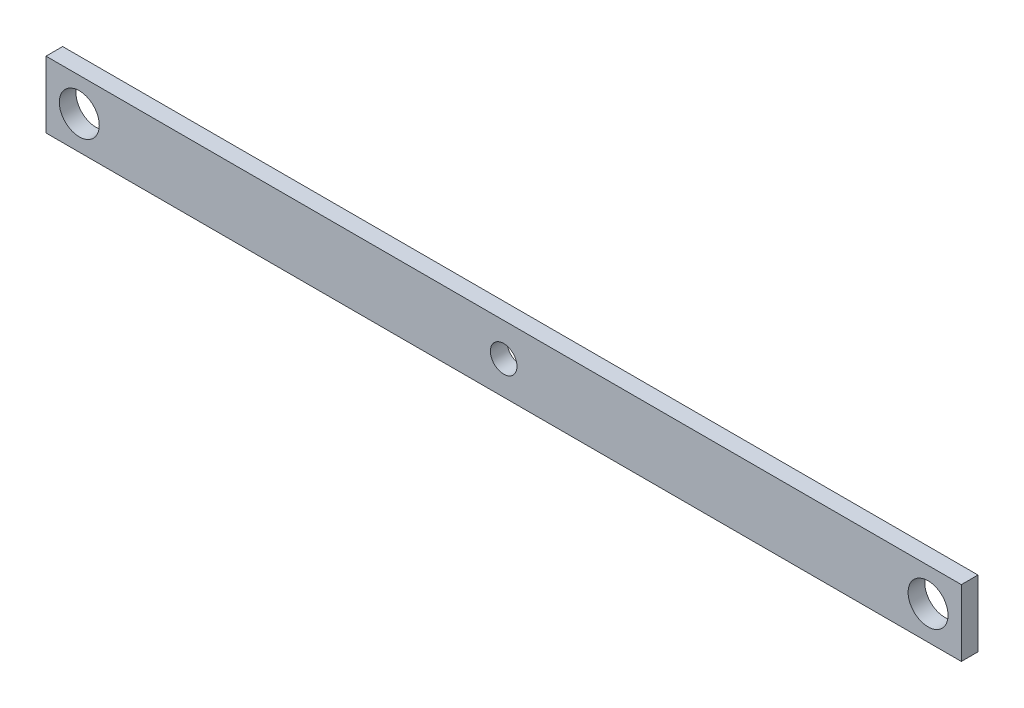
ISO-10303-21;
HEADER;
FILE_DESCRIPTION(('STEP AP214'),'2;1');
FILE_NAME('part.step','',(''),(''),'','','');
FILE_SCHEMA(('AUTOMOTIVE_DESIGN { 1 0 10303 214 1 1 1 1 }'));
ENDSEC;
DATA;
#1=APPLICATION_CONTEXT('core data for automotive mechanical design processes');
#2=APPLICATION_PROTOCOL_DEFINITION('international standard','automotive_design',2000,#1);
#3=PRODUCT_CONTEXT('',#1,'mechanical');
#4=PRODUCT('Part','Part','',(#3));
#5=PRODUCT_RELATED_PRODUCT_CATEGORY('part','',(#4));
#6=PRODUCT_DEFINITION_FORMATION('','',#4);
#7=PRODUCT_DEFINITION_CONTEXT('part definition',#1,'design');
#8=PRODUCT_DEFINITION('design','',#6,#7);
#9=PRODUCT_DEFINITION_SHAPE('','',#8);
#10=(LENGTH_UNIT() NAMED_UNIT(*) SI_UNIT(.MILLI.,.METRE.));
#11=(NAMED_UNIT(*) PLANE_ANGLE_UNIT() SI_UNIT($,.RADIAN.));
#12=(NAMED_UNIT(*) SI_UNIT($,.STERADIAN.) SOLID_ANGLE_UNIT());
#13=UNCERTAINTY_MEASURE_WITH_UNIT(LENGTH_MEASURE(1.E-05),#10,'distance_accuracy_value','');
#14=(GEOMETRIC_REPRESENTATION_CONTEXT(3) GLOBAL_UNCERTAINTY_ASSIGNED_CONTEXT((#13)) GLOBAL_UNIT_ASSIGNED_CONTEXT((#10,
#11,#12)) REPRESENTATION_CONTEXT('',''));
#15=CARTESIAN_POINT('',(0.,0.,0.));
#16=DIRECTION('',(0.,0.,1.));
#17=DIRECTION('',(1.,0.,0.));
#18=AXIS2_PLACEMENT_3D('',#15,#16,#17);
#19=CARTESIAN_POINT('',(0.,0.,5.));
#20=DIRECTION('',(0.,0.,1.));
#21=DIRECTION('',(1.,0.,0.));
#22=AXIS2_PLACEMENT_3D('',#19,#20,#21);
#23=PLANE('',#22);
#24=CARTESIAN_POINT('',(-127.5,0.,5.));
#25=DIRECTION('',(0.,0.,1.));
#26=DIRECTION('',(1.,0.,0.));
#27=AXIS2_PLACEMENT_3D('',#24,#25,#26);
#28=CIRCLE('',#27,6.);
#29=CARTESIAN_POINT('',(-121.5,0.,5.));
#30=VERTEX_POINT('',#29);
#31=EDGE_CURVE('E117',#30,#30,#28,.T.);
#32=ORIENTED_EDGE('',*,*,#31,.F.);
#33=EDGE_LOOP('',(#32));
#34=FACE_BOUND('',#33,.T.);
#35=DIRECTION('',(0.,1.,0.));
#36=VECTOR('',#35,1.);
#37=CARTESIAN_POINT('',(137.5,10.,5.));
#38=LINE('',#37,#36);
#39=CARTESIAN_POINT('',(137.5,-10.,5.));
#40=VERTEX_POINT('',#39);
#41=CARTESIAN_POINT('',(137.5,10.,5.));
#42=VERTEX_POINT('',#41);
#43=EDGE_CURVE('E87',#40,#42,#38,.T.);
#44=ORIENTED_EDGE('',*,*,#43,.T.);
#45=DIRECTION('',(-1.,0.,0.));
#46=VECTOR('',#45,1.);
#47=CARTESIAN_POINT('',(-137.5,10.,5.));
#48=LINE('',#47,#46);
#49=CARTESIAN_POINT('',(-137.5,10.,5.));
#50=VERTEX_POINT('',#49);
#51=EDGE_CURVE('E82',#42,#50,#48,.T.);
#52=ORIENTED_EDGE('',*,*,#51,.T.);
#53=DIRECTION('',(0.,-1.,0.));
#54=VECTOR('',#53,1.);
#55=CARTESIAN_POINT('',(-137.5,10.,5.));
#56=LINE('',#55,#54);
#57=CARTESIAN_POINT('',(-137.5,-10.,5.));
#58=VERTEX_POINT('',#57);
#59=EDGE_CURVE('E85',#50,#58,#56,.T.);
#60=ORIENTED_EDGE('',*,*,#59,.T.);
#61=DIRECTION('',(1.,0.,0.));
#62=VECTOR('',#61,1.);
#63=CARTESIAN_POINT('',(-137.5,-10.,5.));
#64=LINE('',#63,#62);
#65=EDGE_CURVE('E52',#58,#40,#64,.T.);
#66=ORIENTED_EDGE('',*,*,#65,.T.);
#67=EDGE_LOOP('',(#44,#52,#60,#66));
#68=FACE_BOUND('',#67,.T.);
#69=CARTESIAN_POINT('',(0.,0.,5.));
#70=DIRECTION('',(0.,0.,1.));
#71=DIRECTION('',(1.,0.,0.));
#72=AXIS2_PLACEMENT_3D('',#69,#70,#71);
#73=CIRCLE('',#72,4.);
#74=CARTESIAN_POINT('',(4.00000000000003,0.,5.));
#75=VERTEX_POINT('',#74);
#76=EDGE_CURVE('E102',#75,#75,#73,.T.);
#77=ORIENTED_EDGE('',*,*,#76,.F.);
#78=EDGE_LOOP('',(#77));
#79=FACE_BOUND('',#78,.T.);
#80=CARTESIAN_POINT('',(127.5,0.,5.));
#81=DIRECTION('',(0.,0.,1.));
#82=DIRECTION('',(1.,0.,0.));
#83=AXIS2_PLACEMENT_3D('',#80,#81,#82);
#84=CIRCLE('',#83,6.00000000000002);
#85=CARTESIAN_POINT('',(133.5,0.,5.));
#86=VERTEX_POINT('',#85);
#87=EDGE_CURVE('E123',#86,#86,#84,.T.);
#88=ORIENTED_EDGE('',*,*,#87,.F.);
#89=EDGE_LOOP('',(#88));
#90=FACE_BOUND('',#89,.T.);
#91=ADVANCED_FACE('F35',(#34,#68,#79,#90),#23,.T.);
#92=CARTESIAN_POINT('',(0.,0.,0.));
#93=DIRECTION('',(0.,0.,1.));
#94=DIRECTION('',(1.,0.,0.));
#95=AXIS2_PLACEMENT_3D('',#92,#93,#94);
#96=PLANE('',#95);
#97=DIRECTION('',(0.,1.,0.));
#98=VECTOR('',#97,1.);
#99=CARTESIAN_POINT('',(137.5,10.,0.));
#100=LINE('',#99,#98);
#101=CARTESIAN_POINT('',(137.5,-10.,0.));
#102=VERTEX_POINT('',#101);
#103=CARTESIAN_POINT('',(137.5,10.,0.));
#104=VERTEX_POINT('',#103);
#105=EDGE_CURVE('E99',#102,#104,#100,.T.);
#106=ORIENTED_EDGE('',*,*,#105,.F.);
#107=DIRECTION('',(1.,0.,0.));
#108=VECTOR('',#107,1.);
#109=CARTESIAN_POINT('',(-137.5,-10.,0.));
#110=LINE('',#109,#108);
#111=CARTESIAN_POINT('',(-137.5,-10.,0.));
#112=VERTEX_POINT('',#111);
#113=EDGE_CURVE('E75',#112,#102,#110,.T.);
#114=ORIENTED_EDGE('',*,*,#113,.F.);
#115=DIRECTION('',(0.,-1.,0.));
#116=VECTOR('',#115,1.);
#117=CARTESIAN_POINT('',(-137.5,10.,0.));
#118=LINE('',#117,#116);
#119=CARTESIAN_POINT('',(-137.5,10.,0.));
#120=VERTEX_POINT('',#119);
#121=EDGE_CURVE('E69',#120,#112,#118,.T.);
#122=ORIENTED_EDGE('',*,*,#121,.F.);
#123=DIRECTION('',(-1.,0.,0.));
#124=VECTOR('',#123,1.);
#125=CARTESIAN_POINT('',(-137.5,10.,0.));
#126=LINE('',#125,#124);
#127=EDGE_CURVE('E91',#104,#120,#126,.T.);
#128=ORIENTED_EDGE('',*,*,#127,.F.);
#129=EDGE_LOOP('',(#106,#114,#122,#128));
#130=FACE_BOUND('',#129,.T.);
#131=CARTESIAN_POINT('',(0.,0.,0.));
#132=DIRECTION('',(0.,0.,1.));
#133=DIRECTION('',(1.,0.,0.));
#134=AXIS2_PLACEMENT_3D('',#131,#132,#133);
#135=CIRCLE('',#134,4.);
#136=CARTESIAN_POINT('',(4.00000000000003,0.,0.));
#137=VERTEX_POINT('',#136);
#138=EDGE_CURVE('E114',#137,#137,#135,.T.);
#139=ORIENTED_EDGE('',*,*,#138,.T.);
#140=EDGE_LOOP('',(#139));
#141=FACE_BOUND('',#140,.T.);
#142=CARTESIAN_POINT('',(-127.5,0.,0.));
#143=DIRECTION('',(0.,0.,1.));
#144=DIRECTION('',(1.,0.,0.));
#145=AXIS2_PLACEMENT_3D('',#142,#143,#144);
#146=CIRCLE('',#145,6.);
#147=CARTESIAN_POINT('',(-121.5,0.,0.));
#148=VERTEX_POINT('',#147);
#149=EDGE_CURVE('E120',#148,#148,#146,.T.);
#150=ORIENTED_EDGE('',*,*,#149,.T.);
#151=EDGE_LOOP('',(#150));
#152=FACE_BOUND('',#151,.T.);
#153=CARTESIAN_POINT('',(127.5,0.,0.));
#154=DIRECTION('',(0.,0.,1.));
#155=DIRECTION('',(1.,0.,0.));
#156=AXIS2_PLACEMENT_3D('',#153,#154,#155);
#157=CIRCLE('',#156,6.00000000000002);
#158=CARTESIAN_POINT('',(133.5,0.,0.));
#159=VERTEX_POINT('',#158);
#160=EDGE_CURVE('E126',#159,#159,#157,.T.);
#161=ORIENTED_EDGE('',*,*,#160,.T.);
#162=EDGE_LOOP('',(#161));
#163=FACE_BOUND('',#162,.T.);
#164=ADVANCED_FACE('F110',(#130,#141,#152,#163),#96,.F.);
#165=CARTESIAN_POINT('',(137.5,10.,5.));
#166=DIRECTION('',(-1.,0.,0.));
#167=DIRECTION('',(0.,0.,1.));
#168=AXIS2_PLACEMENT_3D('',#165,#166,#167);
#169=PLANE('',#168);
#170=ORIENTED_EDGE('',*,*,#105,.T.);
#171=DIRECTION('',(0.,0.,-1.));
#172=VECTOR('',#171,1.);
#173=CARTESIAN_POINT('',(137.5,10.,5.));
#174=LINE('',#173,#172);
#175=EDGE_CURVE('E11',#42,#104,#174,.T.);
#176=ORIENTED_EDGE('',*,*,#175,.F.);
#177=ORIENTED_EDGE('',*,*,#43,.F.);
#178=DIRECTION('',(0.,0.,-1.));
#179=VECTOR('',#178,1.);
#180=CARTESIAN_POINT('',(137.5,-10.,5.));
#181=LINE('',#180,#179);
#182=EDGE_CURVE('E95',#40,#102,#181,.T.);
#183=ORIENTED_EDGE('',*,*,#182,.T.);
#184=EDGE_LOOP('',(#170,#176,#177,#183));
#185=FACE_BOUND('',#184,.T.);
#186=ADVANCED_FACE('F37',(#185),#169,.F.);
#187=CARTESIAN_POINT('',(-137.5,10.,5.));
#188=DIRECTION('',(0.,-1.,0.));
#189=DIRECTION('',(0.,0.,-1.));
#190=AXIS2_PLACEMENT_3D('',#187,#188,#189);
#191=PLANE('',#190);
#192=ORIENTED_EDGE('',*,*,#127,.T.);
#193=DIRECTION('',(0.,0.,-1.));
#194=VECTOR('',#193,1.);
#195=CARTESIAN_POINT('',(-137.5,10.,5.));
#196=LINE('',#195,#194);
#197=EDGE_CURVE('E44',#50,#120,#196,.T.);
#198=ORIENTED_EDGE('',*,*,#197,.F.);
#199=ORIENTED_EDGE('',*,*,#51,.F.);
#200=ORIENTED_EDGE('',*,*,#175,.T.);
#201=EDGE_LOOP('',(#192,#198,#199,#200));
#202=FACE_BOUND('',#201,.T.);
#203=ADVANCED_FACE('F90',(#202),#191,.F.);
#204=CARTESIAN_POINT('',(-137.5,10.,5.));
#205=DIRECTION('',(1.,0.,0.));
#206=DIRECTION('',(0.,0.,-1.));
#207=AXIS2_PLACEMENT_3D('',#204,#205,#206);
#208=PLANE('',#207);
#209=ORIENTED_EDGE('',*,*,#121,.T.);
#210=DIRECTION('',(0.,0.,-1.));
#211=VECTOR('',#210,1.);
#212=CARTESIAN_POINT('',(-137.5,-10.,5.));
#213=LINE('',#212,#211);
#214=EDGE_CURVE('E92',#58,#112,#213,.T.);
#215=ORIENTED_EDGE('',*,*,#214,.F.);
#216=ORIENTED_EDGE('',*,*,#59,.F.);
#217=ORIENTED_EDGE('',*,*,#197,.T.);
#218=EDGE_LOOP('',(#209,#215,#216,#217));
#219=FACE_BOUND('',#218,.T.);
#220=ADVANCED_FACE('F93',(#219),#208,.F.);
#221=CARTESIAN_POINT('',(-137.5,-10.,5.));
#222=DIRECTION('',(0.,1.,0.));
#223=DIRECTION('',(0.,0.,1.));
#224=AXIS2_PLACEMENT_3D('',#221,#222,#223);
#225=PLANE('',#224);
#226=ORIENTED_EDGE('',*,*,#113,.T.);
#227=ORIENTED_EDGE('',*,*,#182,.F.);
#228=ORIENTED_EDGE('',*,*,#65,.F.);
#229=ORIENTED_EDGE('',*,*,#214,.T.);
#230=EDGE_LOOP('',(#226,#227,#228,#229));
#231=FACE_BOUND('',#230,.T.);
#232=ADVANCED_FACE('F107',(#231),#225,.F.);
#233=CARTESIAN_POINT('',(0.,0.,5.));
#234=DIRECTION('',(0.,0.,-1.));
#235=DIRECTION('',(-1.,0.,0.));
#236=AXIS2_PLACEMENT_3D('',#233,#234,#235);
#237=CYLINDRICAL_SURFACE('',#236,4.);
#238=ORIENTED_EDGE('',*,*,#76,.T.);
#239=EDGE_LOOP('',(#238));
#240=FACE_BOUND('',#239,.T.);
#241=ORIENTED_EDGE('',*,*,#138,.F.);
#242=EDGE_LOOP('',(#241));
#243=FACE_BOUND('',#242,.T.);
#244=ADVANCED_FACE('F144',(#240,#243),#237,.F.);
#245=CARTESIAN_POINT('',(-127.5,0.,5.));
#246=DIRECTION('',(0.,0.,-1.));
#247=DIRECTION('',(-1.,0.,0.));
#248=AXIS2_PLACEMENT_3D('',#245,#246,#247);
#249=CYLINDRICAL_SURFACE('',#248,6.);
#250=ORIENTED_EDGE('',*,*,#31,.T.);
#251=EDGE_LOOP('',(#250));
#252=FACE_BOUND('',#251,.T.);
#253=ORIENTED_EDGE('',*,*,#149,.F.);
#254=EDGE_LOOP('',(#253));
#255=FACE_BOUND('',#254,.T.);
#256=ADVANCED_FACE('F190',(#252,#255),#249,.F.);
#257=CARTESIAN_POINT('',(127.5,0.,5.));
#258=DIRECTION('',(0.,0.,-1.));
#259=DIRECTION('',(-1.,0.,0.));
#260=AXIS2_PLACEMENT_3D('',#257,#258,#259);
#261=CYLINDRICAL_SURFACE('',#260,6.00000000000002);
#262=ORIENTED_EDGE('',*,*,#87,.T.);
#263=EDGE_LOOP('',(#262));
#264=FACE_BOUND('',#263,.T.);
#265=ORIENTED_EDGE('',*,*,#160,.F.);
#266=EDGE_LOOP('',(#265));
#267=FACE_BOUND('',#266,.T.);
#268=ADVANCED_FACE('F132',(#264,#267),#261,.F.);
#269=CLOSED_SHELL('',(#91,#164,#186,#203,#220,#232,#244,#256,#268));
#270=MANIFOLD_SOLID_BREP('B2',#269);
#271=ADVANCED_BREP_SHAPE_REPRESENTATION('',(#18,#270),#14);
#272=SHAPE_DEFINITION_REPRESENTATION(#9,#271);
ENDSEC;
END-ISO-10303-21;
